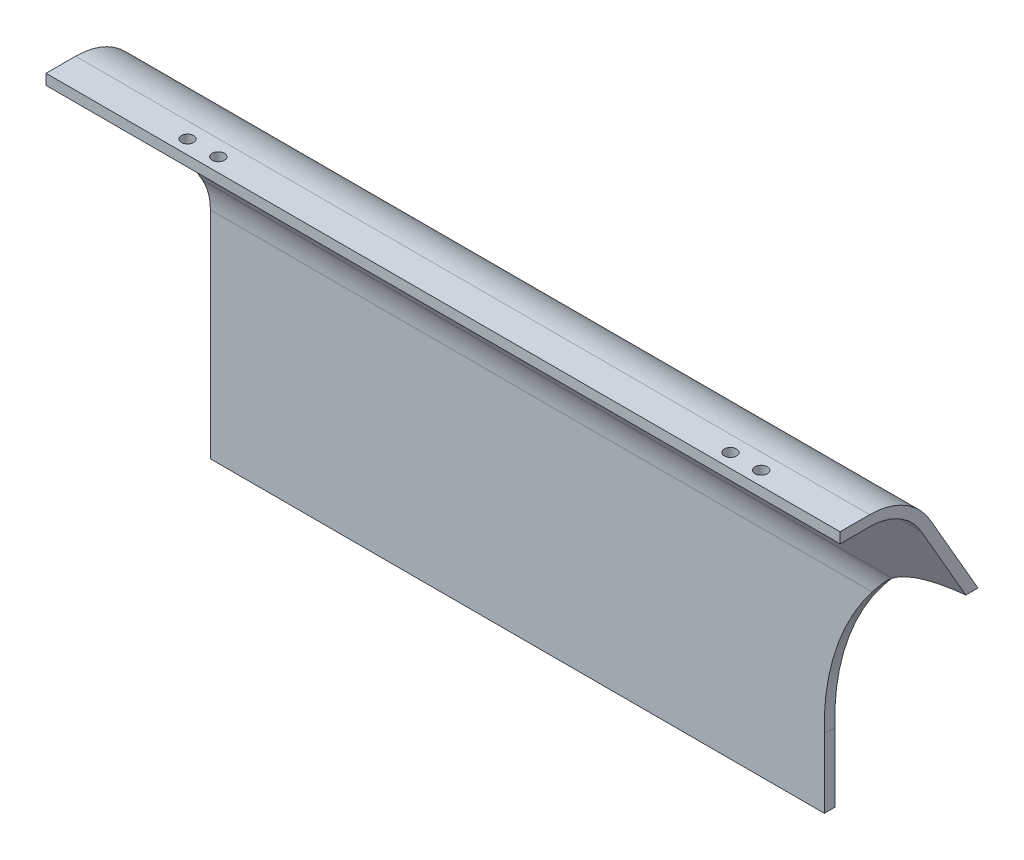
ISO-10303-21;
HEADER;
FILE_DESCRIPTION(('STEP AP214'),'2;1');
FILE_NAME('part.step','',(''),(''),'','','');
FILE_SCHEMA(('AUTOMOTIVE_DESIGN { 1 0 10303 214 1 1 1 1 }'));
ENDSEC;
DATA;
#1=APPLICATION_CONTEXT('core data for automotive mechanical design processes');
#2=APPLICATION_PROTOCOL_DEFINITION('international standard','automotive_design',2000,#1);
#3=PRODUCT_CONTEXT('',#1,'mechanical');
#4=PRODUCT('Part','Part','',(#3));
#5=PRODUCT_RELATED_PRODUCT_CATEGORY('part','',(#4));
#6=PRODUCT_DEFINITION_FORMATION('','',#4);
#7=PRODUCT_DEFINITION_CONTEXT('part definition',#1,'design');
#8=PRODUCT_DEFINITION('design','',#6,#7);
#9=PRODUCT_DEFINITION_SHAPE('','',#8);
#10=(LENGTH_UNIT() NAMED_UNIT(*) SI_UNIT(.MILLI.,.METRE.));
#11=(NAMED_UNIT(*) PLANE_ANGLE_UNIT() SI_UNIT($,.RADIAN.));
#12=(NAMED_UNIT(*) SI_UNIT($,.STERADIAN.) SOLID_ANGLE_UNIT());
#13=UNCERTAINTY_MEASURE_WITH_UNIT(LENGTH_MEASURE(1.E-05),#10,'distance_accuracy_value','');
#14=(GEOMETRIC_REPRESENTATION_CONTEXT(3) GLOBAL_UNCERTAINTY_ASSIGNED_CONTEXT((#13)) GLOBAL_UNIT_ASSIGNED_CONTEXT((#10,
#11,#12)) REPRESENTATION_CONTEXT('',''));
#15=CARTESIAN_POINT('',(0.,0.,0.));
#16=DIRECTION('',(0.,0.,1.));
#17=DIRECTION('',(1.,0.,0.));
#18=AXIS2_PLACEMENT_3D('',#15,#16,#17);
#19=CARTESIAN_POINT('',(126.978079309447,21.7215242270664,46.9999999999999));
#20=DIRECTION('',(0.,0.,-1.));
#21=DIRECTION('',(1.,0.,0.));
#22=AXIS2_PLACEMENT_3D('',#19,#20,#21);
#23=CYLINDRICAL_SURFACE('',#22,65.);
#24=DIRECTION('',(0.,0.,-1.));
#25=VECTOR('',#24,1.);
#26=CARTESIAN_POINT('',(62.0070393434519,19.7814299672324,46.9999999999999));
#27=LINE('',#26,#25);
#28=CARTESIAN_POINT('',(62.0070393434519,19.7814299672324,0.));
#29=VERTEX_POINT('',#28);
#30=CARTESIAN_POINT('',(62.0070393434519,19.7814299672324,-3.));
#31=VERTEX_POINT('',#30);
#32=EDGE_CURVE('E11',#29,#31,#27,.T.);
#33=ORIENTED_EDGE('',*,*,#32,.T.);
#34=CARTESIAN_POINT('',(126.978079309447,21.7215242270664,-3.));
#35=DIRECTION('',(0.,0.,1.));
#36=DIRECTION('',(1.,0.,0.));
#37=AXIS2_PLACEMENT_3D('',#34,#35,#36);
#38=CIRCLE('',#37,65.);
#39=CARTESIAN_POINT('',(75.6805728933956,61.6410161513776,-3.));
#40=VERTEX_POINT('',#39);
#41=EDGE_CURVE('E157',#40,#31,#38,.T.);
#42=ORIENTED_EDGE('',*,*,#41,.F.);
#43=CARTESIAN_POINT('',(85.3482303303956,71.6410161513775,-0.320508075688803));
#44=CARTESIAN_POINT('',(85.0423347646692,71.385918487348,-0.467779956475838));
#45=CARTESIAN_POINT('',(84.7373359272004,71.1267991919212,-0.60987739744638));
#46=CARTESIAN_POINT('',(84.1294442324611,70.6005189772911,-0.883381530419765));
#47=CARTESIAN_POINT('',(83.8265515489721,70.3333574039779,-1.01478734959493));
#48=CARTESIAN_POINT('',(82.9209274384237,69.5192919046817,-1.39269041840845));
#49=CARTESIAN_POINT('',(82.3219093985911,68.9603560010269,-1.62255494704336));
#50=CARTESIAN_POINT('',(81.1463496848747,67.820467219122,-2.03090085386978));
#51=CARTESIAN_POINT('',(80.5696033676565,67.2399916512797,-2.21012542733044));
#52=CARTESIAN_POINT('',(79.4324335028515,66.0508336653938,-2.51743662817031));
#53=CARTESIAN_POINT('',(78.8719990872263,65.4421707621948,-2.64555806192083));
#54=CARTESIAN_POINT('',(77.8680197777471,64.3087208396667,-2.82805757506313));
#55=CARTESIAN_POINT('',(77.4213498218331,63.7881671355725,-2.89147658535113));
#56=CARTESIAN_POINT('',(76.7613349076728,62.9937692173334,-2.95598294088116));
#57=CARTESIAN_POINT('',(76.542306109056,62.7258239609559,-2.97238423065183));
#58=CARTESIAN_POINT('',(76.108319001179,62.1861687636352,-2.99439233464156));
#59=CARTESIAN_POINT('',(75.8933611867286,61.9144583719194,-2.99999784491459));
#60=CARTESIAN_POINT('',(75.6805728933956,61.6410161513776,-3.));
#61=B_SPLINE_CURVE_WITH_KNOTS('',3,(#43,#44,#45,#46,#47,#48,#49,#50,#51,#52,#53,#54,#55,#56,#57,
#58,#59,#60),.UNSPECIFIED.,.F.,.F.,(4,2,2,2,2,2,2,2,4),(0.,1.27387284327257,2.5478495770697,
5.09854318077426,7.60958681315375,10.1189172401118,12.1838951410936,13.2230970100514,
14.2624243890008),.UNSPECIFIED.);
#62=CARTESIAN_POINT('',(85.3482303303957,71.6410161513775,-0.320508075688807));
#63=VERTEX_POINT('',#62);
#64=EDGE_CURVE('E181',#63,#40,#61,.T.);
#65=ORIENTED_EDGE('',*,*,#64,.F.);
#66=CARTESIAN_POINT('',(126.978079309447,21.7215242270664,-29.141540175999));
#67=DIRECTION('',(0.,0.499999999999998,-0.86602540378444));
#68=DIRECTION('',(0.,-0.86602540378444,-0.499999999999998));
#69=AXIS2_PLACEMENT_3D('',#66,#67,#68);
#70=ELLIPSE('',#69,75.0555349946512,65.);
#71=CARTESIAN_POINT('',(113.5,85.3087979390935,7.57058941867404));
#72=VERTEX_POINT('',#71);
#73=EDGE_CURVE('E180',#63,#72,#70,.T.);
#74=ORIENTED_EDGE('',*,*,#73,.T.);
#75=DIRECTION('',(0.,0.,-1.));
#76=VECTOR('',#75,1.);
#77=CARTESIAN_POINT('',(113.5,85.3087979390935,46.9999999999999));
#78=LINE('',#77,#76);
#79=CARTESIAN_POINT('',(113.5,85.3087979390935,11.0346910338118));
#80=VERTEX_POINT('',#79);
#81=EDGE_CURVE('E175',#80,#72,#78,.T.);
#82=ORIENTED_EDGE('',*,*,#81,.F.);
#83=CARTESIAN_POINT('',(126.978079309447,21.7215242270664,-25.6774385608612));
#84=DIRECTION('',(0.,-0.499999999999998,0.86602540378444));
#85=DIRECTION('',(0.,-0.86602540378444,-0.499999999999998));
#86=AXIS2_PLACEMENT_3D('',#83,#84,#85);
#87=ELLIPSE('',#86,75.0555349946512,65.);
#88=CARTESIAN_POINT('',(83.6127382893241,70.1410161513775,2.27756813566452));
#89=VERTEX_POINT('',#88);
#90=EDGE_CURVE('E170',#80,#89,#87,.T.);
#91=ORIENTED_EDGE('',*,*,#90,.T.);
#92=CARTESIAN_POINT('',(83.6127382893241,70.1410161513775,2.27756813566452));
#93=CARTESIAN_POINT('',(83.3616480089941,69.9161368445691,2.14774277892059));
#94=CARTESIAN_POINT('',(83.1108968713338,69.6880378023944,2.022910582567));
#95=CARTESIAN_POINT('',(82.6103880980552,69.225461955044,1.78342741323763));
#96=CARTESIAN_POINT('',(82.3606305217447,68.9909847755029,1.66877703957697));
#97=CARTESIAN_POINT('',(81.6129110690012,68.2776855465004,1.34021349171037));
#98=CARTESIAN_POINT('',(81.1169615795753,67.7894061751419,1.14192540380267));
#99=CARTESIAN_POINT('',(80.1410265578371,66.7966579221638,0.792221566908949));
#100=CARTESIAN_POINT('',(79.6609128884381,66.2925504696603,0.640135838045368));
#101=CARTESIAN_POINT('',(78.711846950537,65.2630049176842,0.38185912734132));
#102=CARTESIAN_POINT('',(78.2428877036457,64.7375807424716,0.275638697577599));
#103=CARTESIAN_POINT('',(77.4226029410888,63.7876039616179,0.130847975804375));
#104=CARTESIAN_POINT('',(77.0685241862307,63.3669160665213,0.082439506259715));
#105=CARTESIAN_POINT('',(76.3679292860928,62.5127073981101,0.0169332948677176));
#106=CARTESIAN_POINT('',(76.0214706384217,62.079125185968,2.3470333731656E-05));
#107=CARTESIAN_POINT('',(75.6805728933955,61.6410161513775,0.));
#108=B_SPLINE_CURVE_WITH_KNOTS('',3,(#92,#93,#94,#95,#96,#97,#98,#99,#100,#101,#102,#103,#104,
#105,#106,#107),.UNSPECIFIED.,.F.,.F.,(4,2,2,2,2,2,2,4),(0.,1.0835220942305,2.16710792374517,
4.33625556596512,6.47225509648827,8.60688115684938,10.2618277297827,11.9266162888067),.UNSPECIFIED.);
#109=CARTESIAN_POINT('',(75.6805728933955,61.6410161513776,0.));
#110=VERTEX_POINT('',#109);
#111=EDGE_CURVE('E48',#89,#110,#108,.T.);
#112=ORIENTED_EDGE('',*,*,#111,.T.);
#113=CARTESIAN_POINT('',(126.978079309447,21.7215242270664,0.));
#114=DIRECTION('',(0.,0.,1.));
#115=DIRECTION('',(1.,0.,0.));
#116=AXIS2_PLACEMENT_3D('',#113,#114,#115);
#117=CIRCLE('',#116,65.);
#118=EDGE_CURVE('E173',#110,#29,#117,.T.);
#119=ORIENTED_EDGE('',*,*,#118,.T.);
#120=EDGE_LOOP('',(#33,#42,#65,#74,#82,#91,#112,#119));
#121=FACE_BOUND('',#120,.T.);
#122=ADVANCED_FACE('F43',(#121),#23,.F.);
#123=CARTESIAN_POINT('',(113.5,67.,-3.));
#124=DIRECTION('',(0.,0.,1.));
#125=DIRECTION('',(0.,1.,0.));
#126=AXIS2_PLACEMENT_3D('',#123,#124,#125);
#127=PLANE('',#126);
#128=DIRECTION('',(0.,-1.,0.));
#129=VECTOR('',#128,1.);
#130=CARTESIAN_POINT('',(62.0070393434519,0.,-3.));
#131=LINE('',#130,#129);
#132=CARTESIAN_POINT('',(62.0070393434519,0.,-3.));
#133=VERTEX_POINT('',#132);
#134=EDGE_CURVE('E147',#31,#133,#131,.T.);
#135=ORIENTED_EDGE('',*,*,#134,.T.);
#136=DIRECTION('',(-1.,0.,0.));
#137=VECTOR('',#136,1.);
#138=CARTESIAN_POINT('',(113.5,0.,-3.));
#139=LINE('',#138,#137);
#140=CARTESIAN_POINT('',(-113.5,0.,-3.));
#141=VERTEX_POINT('',#140);
#142=EDGE_CURVE('E423',#133,#141,#139,.T.);
#143=ORIENTED_EDGE('',*,*,#142,.T.);
#144=DIRECTION('',(0.,-1.,0.));
#145=VECTOR('',#144,1.);
#146=CARTESIAN_POINT('',(-113.5,67.,-3.));
#147=LINE('',#146,#145);
#148=CARTESIAN_POINT('',(-113.5,61.6410161513776,-3.));
#149=VERTEX_POINT('',#148);
#150=EDGE_CURVE('E406',#149,#141,#147,.T.);
#151=ORIENTED_EDGE('',*,*,#150,.F.);
#152=DIRECTION('',(-1.,0.,0.));
#153=VECTOR('',#152,1.);
#154=CARTESIAN_POINT('',(113.5,61.6410161513776,-3.));
#155=LINE('',#154,#153);
#156=EDGE_CURVE('E162',#40,#149,#155,.T.);
#157=ORIENTED_EDGE('',*,*,#156,.F.);
#158=ORIENTED_EDGE('',*,*,#41,.T.);
#159=EDGE_LOOP('',(#135,#143,#151,#157,#158));
#160=FACE_BOUND('',#159,.T.);
#161=ADVANCED_FACE('F159',(#160),#127,.F.);
#162=CARTESIAN_POINT('',(113.5,0.,-3.));
#163=DIRECTION('',(0.,1.,0.));
#164=DIRECTION('',(0.,0.,-1.));
#165=AXIS2_PLACEMENT_3D('',#162,#163,#164);
#166=PLANE('',#165);
#167=DIRECTION('',(-1.,0.,0.));
#168=VECTOR('',#167,1.);
#169=CARTESIAN_POINT('',(113.5,0.,0.));
#170=LINE('',#169,#168);
#171=CARTESIAN_POINT('',(62.0070393434519,0.,0.));
#172=VERTEX_POINT('',#171);
#173=CARTESIAN_POINT('',(-113.5,0.,0.));
#174=VERTEX_POINT('',#173);
#175=EDGE_CURVE('E453',#172,#174,#170,.T.);
#176=ORIENTED_EDGE('',*,*,#175,.T.);
#177=DIRECTION('',(0.,0.,1.));
#178=VECTOR('',#177,1.);
#179=CARTESIAN_POINT('',(-113.5,0.,-3.));
#180=LINE('',#179,#178);
#181=EDGE_CURVE('E403',#141,#174,#180,.T.);
#182=ORIENTED_EDGE('',*,*,#181,.F.);
#183=ORIENTED_EDGE('',*,*,#142,.F.);
#184=DIRECTION('',(0.,0.,-1.));
#185=VECTOR('',#184,1.);
#186=CARTESIAN_POINT('',(62.0070393434519,0.,46.9999999999999));
#187=LINE('',#186,#185);
#188=EDGE_CURVE('E153',#172,#133,#187,.T.);
#189=ORIENTED_EDGE('',*,*,#188,.F.);
#190=EDGE_LOOP('',(#176,#182,#183,#189));
#191=FACE_BOUND('',#190,.T.);
#192=ADVANCED_FACE('F204',(#191),#166,.F.);
#193=CARTESIAN_POINT('',(113.5,0.,0.));
#194=DIRECTION('',(0.,0.,-1.));
#195=DIRECTION('',(1.,0.,0.));
#196=AXIS2_PLACEMENT_3D('',#193,#194,#195);
#197=PLANE('',#196);
#198=ORIENTED_EDGE('',*,*,#118,.F.);
#199=DIRECTION('',(-1.,0.,0.));
#200=VECTOR('',#199,1.);
#201=CARTESIAN_POINT('',(113.5,61.6410161513776,0.));
#202=LINE('',#201,#200);
#203=CARTESIAN_POINT('',(-113.5,61.6410161513776,0.));
#204=VERTEX_POINT('',#203);
#205=EDGE_CURVE('E71',#204,#110,#202,.F.);
#206=ORIENTED_EDGE('',*,*,#205,.F.);
#207=DIRECTION('',(0.,1.,0.));
#208=VECTOR('',#207,1.);
#209=CARTESIAN_POINT('',(-113.5,0.,0.));
#210=LINE('',#209,#208);
#211=EDGE_CURVE('E424',#174,#204,#210,.T.);
#212=ORIENTED_EDGE('',*,*,#211,.F.);
#213=ORIENTED_EDGE('',*,*,#175,.F.);
#214=DIRECTION('',(0.,-1.,0.));
#215=VECTOR('',#214,1.);
#216=CARTESIAN_POINT('',(62.0070393434519,0.,0.));
#217=LINE('',#216,#215);
#218=EDGE_CURVE('E61',#29,#172,#217,.T.);
#219=ORIENTED_EDGE('',*,*,#218,.F.);
#220=EDGE_LOOP('',(#198,#206,#212,#213,#219));
#221=FACE_BOUND('',#220,.T.);
#222=ADVANCED_FACE('F224',(#221),#197,.F.);
#223=CARTESIAN_POINT('',(113.5,66.1961524227066,0.));
#224=DIRECTION('',(0.,0.499999999999998,-0.86602540378444));
#225=DIRECTION('',(0.,-0.86602540378444,-0.499999999999998));
#226=AXIS2_PLACEMENT_3D('',#223,#224,#225);
#227=PLANE('',#226);
#228=DIRECTION('',(0.,0.86602540378444,0.499999999999998));
#229=VECTOR('',#228,1.);
#230=CARTESIAN_POINT('',(113.5,66.1961524227066,0.));
#231=LINE('',#230,#229);
#232=CARTESIAN_POINT('',(113.5,107.461524227066,23.8245735194569));
#233=VERTEX_POINT('',#232);
#234=EDGE_CURVE('E408',#80,#233,#231,.T.);
#235=ORIENTED_EDGE('',*,*,#234,.T.);
#236=DIRECTION('',(-1.,0.,0.));
#237=VECTOR('',#236,1.);
#238=CARTESIAN_POINT('',(113.5,107.461524227066,23.8245735194569));
#239=LINE('',#238,#237);
#240=CARTESIAN_POINT('',(-113.5,107.461524227066,23.8245735194569));
#241=VERTEX_POINT('',#240);
#242=EDGE_CURVE('E472',#241,#233,#239,.F.);
#243=ORIENTED_EDGE('',*,*,#242,.F.);
#244=DIRECTION('',(0.,0.86602540378444,0.499999999999998));
#245=VECTOR('',#244,1.);
#246=CARTESIAN_POINT('',(-113.5,66.1961524227066,0.));
#247=LINE('',#246,#245);
#248=CARTESIAN_POINT('',(-113.5,70.1410161513775,2.27756813566452));
#249=VERTEX_POINT('',#248);
#250=EDGE_CURVE('E430',#249,#241,#247,.T.);
#251=ORIENTED_EDGE('',*,*,#250,.F.);
#252=DIRECTION('',(-1.,0.,0.));
#253=VECTOR('',#252,1.);
#254=CARTESIAN_POINT('',(-113.5,70.1410161513775,2.27756813566452));
#255=LINE('',#254,#253);
#256=EDGE_CURVE('E479',#89,#249,#255,.T.);
#257=ORIENTED_EDGE('',*,*,#256,.F.);
#258=ORIENTED_EDGE('',*,*,#90,.F.);
#259=EDGE_LOOP('',(#235,#243,#251,#257,#258));
#260=FACE_BOUND('',#259,.T.);
#261=ADVANCED_FACE('F245',(#260),#227,.F.);
#262=CARTESIAN_POINT('',(113.5,115.961524227066,28.7320508075688));
#263=DIRECTION('',(0.,1.,0.));
#264=DIRECTION('',(0.,0.,-1.));
#265=AXIS2_PLACEMENT_3D('',#262,#263,#264);
#266=PLANE('',#265);
#267=CARTESIAN_POINT('',(78.2,115.961524227066,43.0470053837925));
#268=DIRECTION('',(0.,-1.,0.));
#269=DIRECTION('',(0.,0.,-1.));
#270=AXIS2_PLACEMENT_3D('',#267,#268,#269);
#271=CIRCLE('',#270,1.75);
#272=CARTESIAN_POINT('',(78.2,115.961524227066,41.2970053837925));
#273=VERTEX_POINT('',#272);
#274=EDGE_CURVE('E390',#273,#273,#271,.T.);
#275=ORIENTED_EDGE('',*,*,#274,.F.);
#276=EDGE_LOOP('',(#275));
#277=FACE_BOUND('',#276,.T.);
#278=CARTESIAN_POINT('',(87.,115.961524227066,43.0470053837925));
#279=DIRECTION('',(0.,-1.,0.));
#280=DIRECTION('',(0.,0.,-1.));
#281=AXIS2_PLACEMENT_3D('',#278,#279,#280);
#282=CIRCLE('',#281,1.75);
#283=CARTESIAN_POINT('',(87.,115.961524227066,41.2970053837925));
#284=VERTEX_POINT('',#283);
#285=EDGE_CURVE('E386',#284,#284,#282,.T.);
#286=ORIENTED_EDGE('',*,*,#285,.F.);
#287=EDGE_LOOP('',(#286));
#288=FACE_BOUND('',#287,.T.);
#289=CARTESIAN_POINT('',(-77.,115.961524227066,43.047005383793));
#290=DIRECTION('',(0.,-1.,0.));
#291=DIRECTION('',(0.,0.,-1.));
#292=AXIS2_PLACEMENT_3D('',#289,#290,#291);
#293=CIRCLE('',#292,1.75000000000001);
#294=CARTESIAN_POINT('',(-77.,115.961524227066,41.297005383793));
#295=VERTEX_POINT('',#294);
#296=EDGE_CURVE('E405',#295,#295,#293,.T.);
#297=ORIENTED_EDGE('',*,*,#296,.F.);
#298=EDGE_LOOP('',(#297));
#299=FACE_BOUND('',#298,.T.);
#300=CARTESIAN_POINT('',(-68.2,115.961524227066,43.047005383793));
#301=DIRECTION('',(0.,-1.,0.));
#302=DIRECTION('',(0.,0.,-1.));
#303=AXIS2_PLACEMENT_3D('',#300,#301,#302);
#304=CIRCLE('',#303,1.75);
#305=CARTESIAN_POINT('',(-68.2,115.961524227066,41.297005383793));
#306=VERTEX_POINT('',#305);
#307=EDGE_CURVE('E396',#306,#306,#304,.T.);
#308=ORIENTED_EDGE('',*,*,#307,.F.);
#309=EDGE_LOOP('',(#308));
#310=FACE_BOUND('',#309,.T.);
#311=DIRECTION('',(0.,0.,1.));
#312=VECTOR('',#311,1.);
#313=CARTESIAN_POINT('',(113.5,115.961524227066,28.7320508075688));
#314=LINE('',#313,#312);
#315=CARTESIAN_POINT('',(113.5,115.961524227066,38.5470053837924));
#316=VERTEX_POINT('',#315);
#317=CARTESIAN_POINT('',(113.5,115.961524227066,46.9999999999999));
#318=VERTEX_POINT('',#317);
#319=EDGE_CURVE('E410',#316,#318,#314,.T.);
#320=ORIENTED_EDGE('',*,*,#319,.T.);
#321=DIRECTION('',(-1.,0.,0.));
#322=VECTOR('',#321,1.);
#323=CARTESIAN_POINT('',(113.5,115.961524227066,46.9999999999999));
#324=LINE('',#323,#322);
#325=CARTESIAN_POINT('',(-113.5,115.961524227066,46.9999999999999));
#326=VERTEX_POINT('',#325);
#327=EDGE_CURVE('E447',#318,#326,#324,.T.);
#328=ORIENTED_EDGE('',*,*,#327,.T.);
#329=DIRECTION('',(0.,0.,1.));
#330=VECTOR('',#329,1.);
#331=CARTESIAN_POINT('',(-113.5,115.961524227066,28.7320508075688));
#332=LINE('',#331,#330);
#333=CARTESIAN_POINT('',(-113.5,115.961524227066,38.5470053837924));
#334=VERTEX_POINT('',#333);
#335=EDGE_CURVE('E429',#334,#326,#332,.T.);
#336=ORIENTED_EDGE('',*,*,#335,.F.);
#337=DIRECTION('',(-1.,0.,0.));
#338=VECTOR('',#337,1.);
#339=CARTESIAN_POINT('',(-113.5,115.961524227066,38.5470053837924));
#340=LINE('',#339,#338);
#341=EDGE_CURVE('E467',#316,#334,#340,.T.);
#342=ORIENTED_EDGE('',*,*,#341,.F.);
#343=EDGE_LOOP('',(#320,#328,#336,#342));
#344=FACE_BOUND('',#343,.T.);
#345=ADVANCED_FACE('F238',(#277,#288,#299,#310,#344),#266,.F.);
#346=CARTESIAN_POINT('',(113.5,115.961524227066,46.9999999999999));
#347=DIRECTION('',(0.,0.,-1.));
#348=DIRECTION('',(1.,0.,0.));
#349=AXIS2_PLACEMENT_3D('',#346,#347,#348);
#350=PLANE('',#349);
#351=DIRECTION('',(0.,1.,0.));
#352=VECTOR('',#351,1.);
#353=CARTESIAN_POINT('',(-113.5,115.961524227066,46.9999999999999));
#354=LINE('',#353,#352);
#355=CARTESIAN_POINT('',(-113.5,118.961524227066,46.9999999999999));
#356=VERTEX_POINT('',#355);
#357=EDGE_CURVE('E433',#326,#356,#354,.T.);
#358=ORIENTED_EDGE('',*,*,#357,.F.);
#359=ORIENTED_EDGE('',*,*,#327,.F.);
#360=DIRECTION('',(0.,1.,0.));
#361=VECTOR('',#360,1.);
#362=CARTESIAN_POINT('',(113.5,115.961524227066,46.9999999999999));
#363=LINE('',#362,#361);
#364=CARTESIAN_POINT('',(113.5,118.961524227066,46.9999999999999));
#365=VERTEX_POINT('',#364);
#366=EDGE_CURVE('E411',#318,#365,#363,.T.);
#367=ORIENTED_EDGE('',*,*,#366,.T.);
#368=DIRECTION('',(-1.,0.,0.));
#369=VECTOR('',#368,1.);
#370=CARTESIAN_POINT('',(113.5,118.961524227066,46.9999999999999));
#371=LINE('',#370,#369);
#372=EDGE_CURVE('E443',#365,#356,#371,.T.);
#373=ORIENTED_EDGE('',*,*,#372,.T.);
#374=EDGE_LOOP('',(#358,#359,#367,#373));
#375=FACE_BOUND('',#374,.T.);
#376=ADVANCED_FACE('F237',(#375),#350,.F.);
#377=CARTESIAN_POINT('',(113.5,118.961524227066,46.9999999999999));
#378=DIRECTION('',(0.,-1.,0.));
#379=DIRECTION('',(0.,0.,1.));
#380=AXIS2_PLACEMENT_3D('',#377,#378,#379);
#381=PLANE('',#380);
#382=CARTESIAN_POINT('',(78.2,118.961524227066,43.0470053837925));
#383=DIRECTION('',(0.,-1.,0.));
#384=DIRECTION('',(0.,0.,-1.));
#385=AXIS2_PLACEMENT_3D('',#382,#383,#384);
#386=CIRCLE('',#385,1.75);
#387=CARTESIAN_POINT('',(78.2,118.961524227066,41.2970053837925));
#388=VERTEX_POINT('',#387);
#389=EDGE_CURVE('E193',#388,#388,#386,.T.);
#390=ORIENTED_EDGE('',*,*,#389,.T.);
#391=EDGE_LOOP('',(#390));
#392=FACE_BOUND('',#391,.T.);
#393=CARTESIAN_POINT('',(87.,118.961524227066,43.0470053837925));
#394=DIRECTION('',(0.,-1.,0.));
#395=DIRECTION('',(0.,0.,-1.));
#396=AXIS2_PLACEMENT_3D('',#393,#394,#395);
#397=CIRCLE('',#396,1.75);
#398=CARTESIAN_POINT('',(87.,118.961524227066,41.2970053837925));
#399=VERTEX_POINT('',#398);
#400=EDGE_CURVE('E186',#399,#399,#397,.T.);
#401=ORIENTED_EDGE('',*,*,#400,.T.);
#402=EDGE_LOOP('',(#401));
#403=FACE_BOUND('',#402,.T.);
#404=CARTESIAN_POINT('',(-77.,118.961524227066,43.047005383793));
#405=DIRECTION('',(0.,-1.,0.));
#406=DIRECTION('',(0.,0.,-1.));
#407=AXIS2_PLACEMENT_3D('',#404,#405,#406);
#408=CIRCLE('',#407,1.75000000000001);
#409=CARTESIAN_POINT('',(-77.,118.961524227066,41.297005383793));
#410=VERTEX_POINT('',#409);
#411=EDGE_CURVE('E394',#410,#410,#408,.T.);
#412=ORIENTED_EDGE('',*,*,#411,.T.);
#413=EDGE_LOOP('',(#412));
#414=FACE_BOUND('',#413,.T.);
#415=CARTESIAN_POINT('',(-68.2,118.961524227066,43.047005383793));
#416=DIRECTION('',(0.,-1.,0.));
#417=DIRECTION('',(0.,0.,-1.));
#418=AXIS2_PLACEMENT_3D('',#415,#416,#417);
#419=CIRCLE('',#418,1.75);
#420=CARTESIAN_POINT('',(-68.2,118.961524227066,41.297005383793));
#421=VERTEX_POINT('',#420);
#422=EDGE_CURVE('E389',#421,#421,#419,.T.);
#423=ORIENTED_EDGE('',*,*,#422,.T.);
#424=EDGE_LOOP('',(#423));
#425=FACE_BOUND('',#424,.T.);
#426=DIRECTION('',(0.,0.,-1.));
#427=VECTOR('',#426,1.);
#428=CARTESIAN_POINT('',(-113.5,118.961524227066,46.9999999999999));
#429=LINE('',#428,#427);
#430=CARTESIAN_POINT('',(-113.5,118.961524227066,38.5470053837924));
#431=VERTEX_POINT('',#430);
#432=EDGE_CURVE('E436',#356,#431,#429,.T.);
#433=ORIENTED_EDGE('',*,*,#432,.F.);
#434=ORIENTED_EDGE('',*,*,#372,.F.);
#435=DIRECTION('',(0.,0.,-1.));
#436=VECTOR('',#435,1.);
#437=CARTESIAN_POINT('',(113.5,118.961524227066,46.9999999999999));
#438=LINE('',#437,#436);
#439=CARTESIAN_POINT('',(113.5,118.961524227066,38.5470053837924));
#440=VERTEX_POINT('',#439);
#441=EDGE_CURVE('E418',#365,#440,#438,.T.);
#442=ORIENTED_EDGE('',*,*,#441,.T.);
#443=DIRECTION('',(-1.,0.,0.));
#444=VECTOR('',#443,1.);
#445=CARTESIAN_POINT('',(113.5,118.961524227066,38.5470053837924));
#446=LINE('',#445,#444);
#447=EDGE_CURVE('E465',#431,#440,#446,.F.);
#448=ORIENTED_EDGE('',*,*,#447,.F.);
#449=EDGE_LOOP('',(#433,#434,#442,#448));
#450=FACE_BOUND('',#449,.T.);
#451=ADVANCED_FACE('F235',(#392,#403,#414,#425,#450),#381,.F.);
#452=CARTESIAN_POINT('',(113.5,118.961524227066,26.9999999999999));
#453=DIRECTION('',(0.,-0.499999999999998,0.86602540378444));
#454=DIRECTION('',(0.,0.86602540378444,0.499999999999998));
#455=AXIS2_PLACEMENT_3D('',#452,#453,#454);
#456=PLANE('',#455);
#457=DIRECTION('',(-1.,0.,0.));
#458=VECTOR('',#457,1.);
#459=CARTESIAN_POINT('',(113.5,71.6410161513775,-0.320508075688807));
#460=LINE('',#459,#458);
#461=CARTESIAN_POINT('',(-113.5,71.6410161513775,-0.32050807568881));
#462=VERTEX_POINT('',#461);
#463=EDGE_CURVE('E460',#462,#63,#460,.F.);
#464=ORIENTED_EDGE('',*,*,#463,.F.);
#465=DIRECTION('',(0.,-0.86602540378444,-0.499999999999998));
#466=VECTOR('',#465,1.);
#467=CARTESIAN_POINT('',(-113.5,118.961524227066,26.9999999999999));
#468=LINE('',#467,#466);
#469=CARTESIAN_POINT('',(-113.5,108.961524227066,21.2264973081036));
#470=VERTEX_POINT('',#469);
#471=EDGE_CURVE('E438',#470,#462,#468,.T.);
#472=ORIENTED_EDGE('',*,*,#471,.F.);
#473=DIRECTION('',(-1.,0.,0.));
#474=VECTOR('',#473,1.);
#475=CARTESIAN_POINT('',(113.5,108.961524227066,21.2264973081036));
#476=LINE('',#475,#474);
#477=CARTESIAN_POINT('',(113.5,108.961524227066,21.2264973081036));
#478=VERTEX_POINT('',#477);
#479=EDGE_CURVE('E459',#478,#470,#476,.T.);
#480=ORIENTED_EDGE('',*,*,#479,.F.);
#481=DIRECTION('',(0.,-0.86602540378444,-0.499999999999998));
#482=VECTOR('',#481,1.);
#483=CARTESIAN_POINT('',(113.5,118.961524227066,26.9999999999999));
#484=LINE('',#483,#482);
#485=EDGE_CURVE('E420',#478,#72,#484,.T.);
#486=ORIENTED_EDGE('',*,*,#485,.T.);
#487=ORIENTED_EDGE('',*,*,#73,.F.);
#488=EDGE_LOOP('',(#464,#472,#480,#486,#487));
#489=FACE_BOUND('',#488,.T.);
#490=ADVANCED_FACE('F227',(#489),#456,.F.);
#491=CARTESIAN_POINT('',(113.5,0.,0.));
#492=DIRECTION('',(1.,0.,0.));
#493=DIRECTION('',(0.,0.,1.));
#494=AXIS2_PLACEMENT_3D('',#491,#492,#493);
#495=PLANE('',#494);
#496=ORIENTED_EDGE('',*,*,#81,.T.);
#497=ORIENTED_EDGE('',*,*,#485,.F.);
#498=CARTESIAN_POINT('',(113.5,98.9615242270664,38.5470053837924));
#499=DIRECTION('',(-1.,0.,0.));
#500=DIRECTION('',(0.,0.,1.));
#501=AXIS2_PLACEMENT_3D('',#498,#499,#500);
#502=CIRCLE('',#501,20.);
#503=EDGE_CURVE('E470',#440,#478,#502,.T.);
#504=ORIENTED_EDGE('',*,*,#503,.F.);
#505=ORIENTED_EDGE('',*,*,#441,.F.);
#506=ORIENTED_EDGE('',*,*,#366,.F.);
#507=ORIENTED_EDGE('',*,*,#319,.F.);
#508=CARTESIAN_POINT('',(113.5,98.9615242270664,38.5470053837924));
#509=DIRECTION('',(-1.,0.,0.));
#510=DIRECTION('',(0.,0.,1.));
#511=AXIS2_PLACEMENT_3D('',#508,#509,#510);
#512=CIRCLE('',#511,17.);
#513=EDGE_CURVE('E480',#233,#316,#512,.F.);
#514=ORIENTED_EDGE('',*,*,#513,.F.);
#515=ORIENTED_EDGE('',*,*,#234,.F.);
#516=EDGE_LOOP('',(#496,#497,#504,#505,#506,#507,#514,#515));
#517=FACE_BOUND('',#516,.T.);
#518=ADVANCED_FACE('F233',(#517),#495,.T.);
#519=CARTESIAN_POINT('',(-113.5,0.,0.));
#520=DIRECTION('',(1.,0.,0.));
#521=DIRECTION('',(0.,0.,1.));
#522=AXIS2_PLACEMENT_3D('',#519,#520,#521);
#523=PLANE('',#522);
#524=ORIENTED_EDGE('',*,*,#471,.T.);
#525=CARTESIAN_POINT('',(-113.5,61.6410161513776,17.));
#526=DIRECTION('',(-1.,0.,0.));
#527=DIRECTION('',(0.,0.,1.));
#528=AXIS2_PLACEMENT_3D('',#525,#526,#527);
#529=CIRCLE('',#528,20.);
#530=EDGE_CURVE('E454',#149,#462,#529,.F.);
#531=ORIENTED_EDGE('',*,*,#530,.F.);
#532=ORIENTED_EDGE('',*,*,#150,.T.);
#533=ORIENTED_EDGE('',*,*,#181,.T.);
#534=ORIENTED_EDGE('',*,*,#211,.T.);
#535=CARTESIAN_POINT('',(-113.5,61.6410161513776,17.));
#536=DIRECTION('',(-1.,0.,0.));
#537=DIRECTION('',(0.,0.,1.));
#538=AXIS2_PLACEMENT_3D('',#535,#536,#537);
#539=CIRCLE('',#538,17.);
#540=EDGE_CURVE('E485',#249,#204,#539,.T.);
#541=ORIENTED_EDGE('',*,*,#540,.F.);
#542=ORIENTED_EDGE('',*,*,#250,.T.);
#543=CARTESIAN_POINT('',(-113.5,98.9615242270664,38.5470053837924));
#544=DIRECTION('',(-1.,0.,0.));
#545=DIRECTION('',(0.,0.,1.));
#546=AXIS2_PLACEMENT_3D('',#543,#544,#545);
#547=CIRCLE('',#546,17.);
#548=EDGE_CURVE('E474',#334,#241,#547,.T.);
#549=ORIENTED_EDGE('',*,*,#548,.F.);
#550=ORIENTED_EDGE('',*,*,#335,.T.);
#551=ORIENTED_EDGE('',*,*,#357,.T.);
#552=ORIENTED_EDGE('',*,*,#432,.T.);
#553=CARTESIAN_POINT('',(-113.5,98.9615242270664,38.5470053837924));
#554=DIRECTION('',(-1.,0.,0.));
#555=DIRECTION('',(0.,0.,1.));
#556=AXIS2_PLACEMENT_3D('',#553,#554,#555);
#557=CIRCLE('',#556,20.);
#558=EDGE_CURVE('E464',#470,#431,#557,.F.);
#559=ORIENTED_EDGE('',*,*,#558,.F.);
#560=EDGE_LOOP('',(#524,#531,#532,#533,#534,#541,#542,#549,#550,#551,#552,#559));
#561=FACE_BOUND('',#560,.T.);
#562=ADVANCED_FACE('F205',(#561),#523,.F.);
#563=CARTESIAN_POINT('',(113.5,61.6410161513776,17.));
#564=DIRECTION('',(-1.,0.,0.));
#565=DIRECTION('',(0.,0.,-1.));
#566=AXIS2_PLACEMENT_3D('',#563,#564,#565);
#567=CYLINDRICAL_SURFACE('',#566,20.);
#568=ORIENTED_EDGE('',*,*,#64,.T.);
#569=ORIENTED_EDGE('',*,*,#156,.T.);
#570=ORIENTED_EDGE('',*,*,#530,.T.);
#571=ORIENTED_EDGE('',*,*,#463,.T.);
#572=EDGE_LOOP('',(#568,#569,#570,#571));
#573=FACE_BOUND('',#572,.T.);
#574=ADVANCED_FACE('F198',(#573),#567,.T.);
#575=CARTESIAN_POINT('',(113.5,98.9615242270664,38.5470053837924));
#576=DIRECTION('',(-1.,0.,0.));
#577=DIRECTION('',(0.,0.,-1.));
#578=AXIS2_PLACEMENT_3D('',#575,#576,#577);
#579=CYLINDRICAL_SURFACE('',#578,20.);
#580=ORIENTED_EDGE('',*,*,#503,.T.);
#581=ORIENTED_EDGE('',*,*,#479,.T.);
#582=ORIENTED_EDGE('',*,*,#558,.T.);
#583=ORIENTED_EDGE('',*,*,#447,.T.);
#584=EDGE_LOOP('',(#580,#581,#582,#583));
#585=FACE_BOUND('',#584,.T.);
#586=ADVANCED_FACE('F203',(#585),#579,.T.);
#587=CARTESIAN_POINT('',(113.5,98.9615242270664,38.5470053837924));
#588=DIRECTION('',(1.,0.,0.));
#589=DIRECTION('',(0.,0.,1.));
#590=AXIS2_PLACEMENT_3D('',#587,#588,#589);
#591=CYLINDRICAL_SURFACE('',#590,17.);
#592=ORIENTED_EDGE('',*,*,#513,.T.);
#593=ORIENTED_EDGE('',*,*,#341,.T.);
#594=ORIENTED_EDGE('',*,*,#548,.T.);
#595=ORIENTED_EDGE('',*,*,#242,.T.);
#596=EDGE_LOOP('',(#592,#593,#594,#595));
#597=FACE_BOUND('',#596,.T.);
#598=ADVANCED_FACE('F210',(#597),#591,.F.);
#599=CARTESIAN_POINT('',(113.5,61.6410161513776,17.));
#600=DIRECTION('',(1.,0.,0.));
#601=DIRECTION('',(0.,0.,1.));
#602=AXIS2_PLACEMENT_3D('',#599,#600,#601);
#603=CYLINDRICAL_SURFACE('',#602,17.);
#604=ORIENTED_EDGE('',*,*,#256,.T.);
#605=ORIENTED_EDGE('',*,*,#540,.T.);
#606=ORIENTED_EDGE('',*,*,#205,.T.);
#607=ORIENTED_EDGE('',*,*,#111,.F.);
#608=EDGE_LOOP('',(#604,#605,#606,#607));
#609=FACE_BOUND('',#608,.T.);
#610=ADVANCED_FACE('F44',(#609),#603,.F.);
#611=CARTESIAN_POINT('',(-68.2,114.961524227066,43.047005383793));
#612=DIRECTION('',(0.,1.,0.));
#613=DIRECTION('',(0.,0.,-1.));
#614=AXIS2_PLACEMENT_3D('',#611,#612,#613);
#615=CYLINDRICAL_SURFACE('',#614,1.75);
#616=ORIENTED_EDGE('',*,*,#422,.F.);
#617=EDGE_LOOP('',(#616));
#618=FACE_BOUND('',#617,.T.);
#619=ORIENTED_EDGE('',*,*,#307,.T.);
#620=EDGE_LOOP('',(#619));
#621=FACE_BOUND('',#620,.T.);
#622=ADVANCED_FACE('F212',(#618,#621),#615,.F.);
#623=CARTESIAN_POINT('',(-77.,114.961524227066,43.047005383793));
#624=DIRECTION('',(0.,1.,0.));
#625=DIRECTION('',(0.,0.,-1.));
#626=AXIS2_PLACEMENT_3D('',#623,#624,#625);
#627=CYLINDRICAL_SURFACE('',#626,1.75000000000001);
#628=ORIENTED_EDGE('',*,*,#411,.F.);
#629=EDGE_LOOP('',(#628));
#630=FACE_BOUND('',#629,.T.);
#631=ORIENTED_EDGE('',*,*,#296,.T.);
#632=EDGE_LOOP('',(#631));
#633=FACE_BOUND('',#632,.T.);
#634=ADVANCED_FACE('F323',(#630,#633),#627,.F.);
#635=CARTESIAN_POINT('',(87.,114.961524227066,43.0470053837925));
#636=DIRECTION('',(0.,1.,0.));
#637=DIRECTION('',(0.,0.,-1.));
#638=AXIS2_PLACEMENT_3D('',#635,#636,#637);
#639=CYLINDRICAL_SURFACE('',#638,1.75);
#640=ORIENTED_EDGE('',*,*,#400,.F.);
#641=EDGE_LOOP('',(#640));
#642=FACE_BOUND('',#641,.T.);
#643=ORIENTED_EDGE('',*,*,#285,.T.);
#644=EDGE_LOOP('',(#643));
#645=FACE_BOUND('',#644,.T.);
#646=ADVANCED_FACE('F334',(#642,#645),#639,.F.);
#647=CARTESIAN_POINT('',(78.2,114.961524227066,43.0470053837925));
#648=DIRECTION('',(0.,1.,0.));
#649=DIRECTION('',(0.,0.,-1.));
#650=AXIS2_PLACEMENT_3D('',#647,#648,#649);
#651=CYLINDRICAL_SURFACE('',#650,1.75);
#652=ORIENTED_EDGE('',*,*,#389,.F.);
#653=EDGE_LOOP('',(#652));
#654=FACE_BOUND('',#653,.T.);
#655=ORIENTED_EDGE('',*,*,#274,.T.);
#656=EDGE_LOOP('',(#655));
#657=FACE_BOUND('',#656,.T.);
#658=ADVANCED_FACE('F341',(#654,#657),#651,.F.);
#659=CARTESIAN_POINT('',(62.0070393434519,0.,46.9999999999999));
#660=DIRECTION('',(-1.,0.,0.));
#661=DIRECTION('',(0.,0.,-1.));
#662=AXIS2_PLACEMENT_3D('',#659,#660,#661);
#663=PLANE('',#662);
#664=ORIENTED_EDGE('',*,*,#32,.F.);
#665=ORIENTED_EDGE('',*,*,#218,.T.);
#666=ORIENTED_EDGE('',*,*,#188,.T.);
#667=ORIENTED_EDGE('',*,*,#134,.F.);
#668=EDGE_LOOP('',(#664,#665,#666,#667));
#669=FACE_BOUND('',#668,.T.);
#670=ADVANCED_FACE('F155',(#669),#663,.F.);
#671=CLOSED_SHELL('',(#122,#161,#192,#222,#261,#345,#376,#451,#490,#518,#562,#574,#586,#598,
#610,#622,#634,#646,#658,#670));
#672=MANIFOLD_SOLID_BREP('B2',#671);
#673=ADVANCED_BREP_SHAPE_REPRESENTATION('',(#18,#672),#14);
#674=SHAPE_DEFINITION_REPRESENTATION(#9,#673);
ENDSEC;
END-ISO-10303-21;
